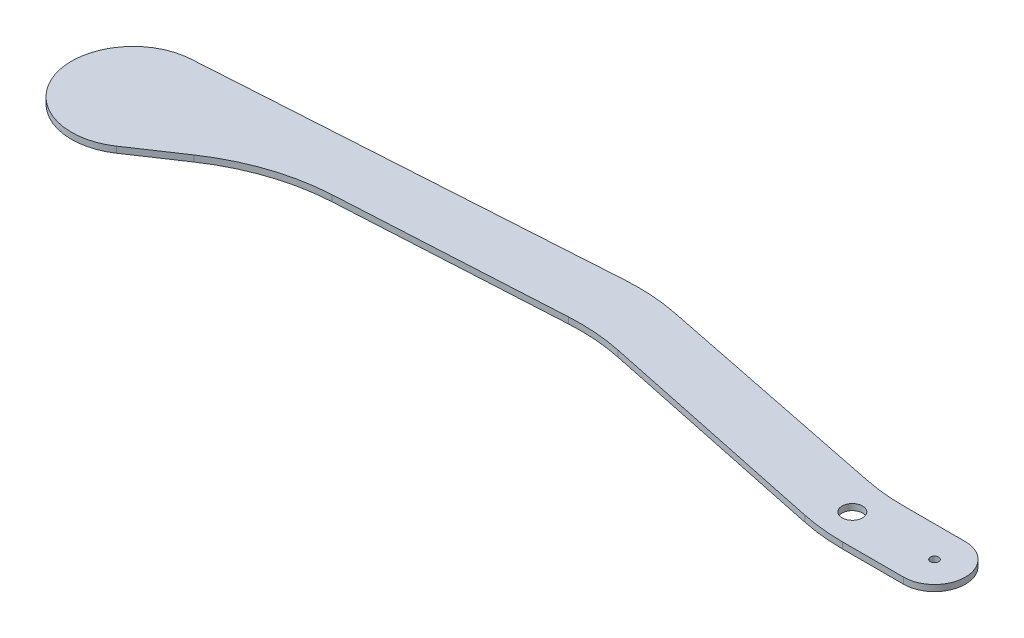
ISO-10303-21;
HEADER;
FILE_DESCRIPTION(('STEP AP214'),'2;1');
FILE_NAME('part.step','',(''),(''),'','','');
FILE_SCHEMA(('AUTOMOTIVE_DESIGN { 1 0 10303 214 1 1 1 1 }'));
ENDSEC;
DATA;
#1=APPLICATION_CONTEXT('core data for automotive mechanical design processes');
#2=APPLICATION_PROTOCOL_DEFINITION('international standard','automotive_design',2000,#1);
#3=PRODUCT_CONTEXT('',#1,'mechanical');
#4=PRODUCT('Part','Part','',(#3));
#5=PRODUCT_RELATED_PRODUCT_CATEGORY('part','',(#4));
#6=PRODUCT_DEFINITION_FORMATION('','',#4);
#7=PRODUCT_DEFINITION_CONTEXT('part definition',#1,'design');
#8=PRODUCT_DEFINITION('design','',#6,#7);
#9=PRODUCT_DEFINITION_SHAPE('','',#8);
#10=(LENGTH_UNIT() NAMED_UNIT(*) SI_UNIT(.MILLI.,.METRE.));
#11=(NAMED_UNIT(*) PLANE_ANGLE_UNIT() SI_UNIT($,.RADIAN.));
#12=(NAMED_UNIT(*) SI_UNIT($,.STERADIAN.) SOLID_ANGLE_UNIT());
#13=UNCERTAINTY_MEASURE_WITH_UNIT(LENGTH_MEASURE(1.E-05),#10,'distance_accuracy_value','');
#14=(GEOMETRIC_REPRESENTATION_CONTEXT(3) GLOBAL_UNCERTAINTY_ASSIGNED_CONTEXT((#13)) GLOBAL_UNIT_ASSIGNED_CONTEXT((#10,
#11,#12)) REPRESENTATION_CONTEXT('',''));
#15=CARTESIAN_POINT('',(0.,0.,0.));
#16=DIRECTION('',(0.,0.,1.));
#17=DIRECTION('',(1.,0.,0.));
#18=AXIS2_PLACEMENT_3D('',#15,#16,#17);
#19=CARTESIAN_POINT('',(-350.,3.,0.));
#20=DIRECTION('',(0.,-1.,0.));
#21=DIRECTION('',(0.,0.,-1.));
#22=AXIS2_PLACEMENT_3D('',#19,#20,#21);
#23=CYLINDRICAL_SURFACE('',#22,30.);
#24=CARTESIAN_POINT('',(-350.,0.,0.));
#25=DIRECTION('',(0.,1.,0.));
#26=DIRECTION('',(0.,0.,1.));
#27=AXIS2_PLACEMENT_3D('',#24,#25,#26);
#28=CIRCLE('',#27,30.);
#29=CARTESIAN_POINT('',(-351.875417006676,0.,-29.9413228006224));
#30=VERTEX_POINT('',#29);
#31=CARTESIAN_POINT('',(-333.28573951652,0.,24.9125168638253));
#32=VERTEX_POINT('',#31);
#33=EDGE_CURVE('E161',#30,#32,#28,.T.);
#34=ORIENTED_EDGE('',*,*,#33,.T.);
#35=DIRECTION('',(0.,-1.,0.));
#36=VECTOR('',#35,1.);
#37=CARTESIAN_POINT('',(-333.28573951652,3.,24.9125168638253));
#38=LINE('',#37,#36);
#39=CARTESIAN_POINT('',(-333.28573951652,3.,24.9125168638253));
#40=VERTEX_POINT('',#39);
#41=EDGE_CURVE('E142',#40,#32,#38,.T.);
#42=ORIENTED_EDGE('',*,*,#41,.F.);
#43=CARTESIAN_POINT('',(-350.,3.,0.));
#44=DIRECTION('',(0.,1.,0.));
#45=DIRECTION('',(0.,0.,1.));
#46=AXIS2_PLACEMENT_3D('',#43,#44,#45);
#47=CIRCLE('',#46,30.);
#48=CARTESIAN_POINT('',(-351.875417006676,3.,-29.9413228006224));
#49=VERTEX_POINT('',#48);
#50=EDGE_CURVE('E148',#49,#40,#47,.T.);
#51=ORIENTED_EDGE('',*,*,#50,.F.);
#52=DIRECTION('',(0.,-1.,0.));
#53=VECTOR('',#52,1.);
#54=CARTESIAN_POINT('',(-351.875417006676,3.,-29.9413228006224));
#55=LINE('',#54,#53);
#56=EDGE_CURVE('E243',#49,#30,#55,.T.);
#57=ORIENTED_EDGE('',*,*,#56,.T.);
#58=EDGE_LOOP('',(#34,#42,#51,#57));
#59=FACE_BOUND('',#58,.T.);
#60=ADVANCED_FACE('F35',(#59),#23,.T.);
#61=CARTESIAN_POINT('',(-91.9282686591511,3.,-137.018598309922));
#62=DIRECTION('',(-0.557142016116002,0.,-0.830417228794174));
#63=DIRECTION('',(-0.830417228794175,0.,0.557142016116002));
#64=AXIS2_PLACEMENT_3D('',#61,#62,#63);
#65=PLANE('',#64);
#66=DIRECTION('',(0.830417228794175,0.,-0.557142016116002));
#67=VECTOR('',#66,1.);
#68=CARTESIAN_POINT('',(-91.9282686591511,0.,-137.018598309922));
#69=LINE('',#68,#67);
#70=CARTESIAN_POINT('',(-310.608396728041,0.,9.6978753038556));
#71=VERTEX_POINT('',#70);
#72=EDGE_CURVE('E211',#32,#71,#69,.T.);
#73=ORIENTED_EDGE('',*,*,#72,.T.);
#74=DIRECTION('',(0.,-1.,0.));
#75=VECTOR('',#74,1.);
#76=CARTESIAN_POINT('',(-310.608396728041,3.,9.69787530385564));
#77=LINE('',#76,#75);
#78=CARTESIAN_POINT('',(-310.608396728041,3.,9.6978753038556));
#79=VERTEX_POINT('',#78);
#80=EDGE_CURVE('E145',#71,#79,#77,.F.);
#81=ORIENTED_EDGE('',*,*,#80,.T.);
#82=DIRECTION('',(0.830417228794175,0.,-0.557142016116002));
#83=VECTOR('',#82,1.);
#84=CARTESIAN_POINT('',(-91.9282686591511,3.,-137.018598309922));
#85=LINE('',#84,#83);
#86=EDGE_CURVE('E137',#40,#79,#85,.T.);
#87=ORIENTED_EDGE('',*,*,#86,.F.);
#88=ORIENTED_EDGE('',*,*,#41,.T.);
#89=EDGE_LOOP('',(#73,#81,#87,#88));
#90=FACE_BOUND('',#89,.T.);
#91=ADVANCED_FACE('F140',(#90),#65,.F.);
#92=CARTESIAN_POINT('',(-1.19004921764275,3.,-21.4737935567704));
#93=DIRECTION('',(-0.0553337702493512,0.,-0.998467913290153));
#94=DIRECTION('',(-0.998467913290153,0.,0.0553337702493512));
#95=AXIS2_PLACEMENT_3D('',#92,#93,#94);
#96=PLANE('',#95);
#97=DIRECTION('',(0.998467913290153,0.,-0.0553337702493512));
#98=VECTOR('',#97,1.);
#99=CARTESIAN_POINT('',(-1.19004921764275,0.,-21.4737935567704));
#100=LINE('',#99,#98);
#101=CARTESIAN_POINT('',(-260.427572141376,0.,-7.1071931457422));
#102=VERTEX_POINT('',#101);
#103=CARTESIAN_POINT('',(-151.198358450132,0.,-13.1605316000468));
#104=VERTEX_POINT('',#103);
#105=EDGE_CURVE('E213',#102,#104,#100,.T.);
#106=ORIENTED_EDGE('',*,*,#105,.T.);
#107=DIRECTION('',(0.,-1.,0.));
#108=VECTOR('',#107,1.);
#109=CARTESIAN_POINT('',(-151.198358450132,3.,-13.1605316000468));
#110=LINE('',#109,#108);
#111=CARTESIAN_POINT('',(-151.198358450132,3.,-13.1605316000468));
#112=VERTEX_POINT('',#111);
#113=EDGE_CURVE('E196',#104,#112,#110,.F.);
#114=ORIENTED_EDGE('',*,*,#113,.T.);
#115=DIRECTION('',(0.998467913290153,0.,-0.0553337702493512));
#116=VECTOR('',#115,1.);
#117=CARTESIAN_POINT('',(-1.19004921764275,3.,-21.4737935567704));
#118=LINE('',#117,#116);
#119=CARTESIAN_POINT('',(-260.427572141376,3.,-7.1071931457422));
#120=VERTEX_POINT('',#119);
#121=EDGE_CURVE('E147',#120,#112,#118,.T.);
#122=ORIENTED_EDGE('',*,*,#121,.F.);
#123=DIRECTION('',(0.,-1.,0.));
#124=VECTOR('',#123,1.);
#125=CARTESIAN_POINT('',(-260.427572141376,0.,-7.10719314574219));
#126=LINE('',#125,#124);
#127=EDGE_CURVE('E193',#120,#102,#126,.T.);
#128=ORIENTED_EDGE('',*,*,#127,.T.);
#129=EDGE_LOOP('',(#106,#114,#122,#128));
#130=FACE_BOUND('',#129,.T.);
#131=ADVANCED_FACE('F221',(#130),#96,.F.);
#132=CARTESIAN_POINT('',(-3.01378585704881,3.,14.3910568491865));
#133=DIRECTION('',(0.20497419413347,0.,-0.978767377745772));
#134=DIRECTION('',(-0.978767377745772,0.,-0.20497419413347));
#135=AXIS2_PLACEMENT_3D('',#132,#133,#134);
#136=PLANE('',#135);
#137=DIRECTION('',(0.978767377745772,0.,0.20497419413347));
#138=VECTOR('',#137,1.);
#139=CARTESIAN_POINT('',(-3.01378585704881,0.,14.3910568491865));
#140=LINE('',#139,#138);
#141=CARTESIAN_POINT('',(-125.16756201185,0.,-11.1904780456087));
#142=VERTEX_POINT('',#141);
#143=CARTESIAN_POINT('',(-10.2447746944077,0.,12.8767377745772));
#144=VERTEX_POINT('',#143);
#145=EDGE_CURVE('E246',#142,#144,#140,.T.);
#146=ORIENTED_EDGE('',*,*,#145,.T.);
#147=DIRECTION('',(0.,-1.,0.));
#148=VECTOR('',#147,1.);
#149=CARTESIAN_POINT('',(-10.2447746944077,3.,12.8767377745772));
#150=LINE('',#149,#148);
#151=CARTESIAN_POINT('',(-10.2447746944077,3.,12.8767377745772));
#152=VERTEX_POINT('',#151);
#153=EDGE_CURVE('E179',#144,#152,#150,.F.);
#154=ORIENTED_EDGE('',*,*,#153,.T.);
#155=DIRECTION('',(0.978767377745772,0.,0.20497419413347));
#156=VECTOR('',#155,1.);
#157=CARTESIAN_POINT('',(-3.01378585704881,3.,14.3910568491865));
#158=LINE('',#157,#156);
#159=CARTESIAN_POINT('',(-125.16756201185,3.,-11.1904780456087));
#160=VERTEX_POINT('',#159);
#161=EDGE_CURVE('E223',#160,#152,#158,.T.);
#162=ORIENTED_EDGE('',*,*,#161,.F.);
#163=DIRECTION('',(0.,-1.,0.));
#164=VECTOR('',#163,1.);
#165=CARTESIAN_POINT('',(-125.16756201185,0.,-11.1904780456087));
#166=LINE('',#165,#164);
#167=EDGE_CURVE('E176',#160,#142,#166,.T.);
#168=ORIENTED_EDGE('',*,*,#167,.T.);
#169=EDGE_LOOP('',(#146,#154,#162,#168));
#170=FACE_BOUND('',#169,.T.);
#171=ADVANCED_FACE('F327',(#170),#136,.F.);
#172=CARTESIAN_POINT('',(0.,3.,15.));
#173=DIRECTION('',(0.,0.,-1.));
#174=DIRECTION('',(-1.,0.,0.));
#175=AXIS2_PLACEMENT_3D('',#172,#173,#174);
#176=PLANE('',#175);
#177=DIRECTION('',(1.,0.,0.));
#178=VECTOR('',#177,1.);
#179=CARTESIAN_POINT('',(0.,3.,15.));
#180=LINE('',#179,#178);
#181=CARTESIAN_POINT('',(10.2526447189393,3.,15.));
#182=VERTEX_POINT('',#181);
#183=CARTESIAN_POINT('',(40.,3.,15.));
#184=VERTEX_POINT('',#183);
#185=EDGE_CURVE('E225',#182,#184,#180,.T.);
#186=ORIENTED_EDGE('',*,*,#185,.F.);
#187=DIRECTION('',(0.,-1.,0.));
#188=VECTOR('',#187,1.);
#189=CARTESIAN_POINT('',(10.2526447189393,3.,15.));
#190=LINE('',#189,#188);
#191=CARTESIAN_POINT('',(10.2526447189393,0.,15.));
#192=VERTEX_POINT('',#191);
#193=EDGE_CURVE('E162',#182,#192,#190,.T.);
#194=ORIENTED_EDGE('',*,*,#193,.T.);
#195=DIRECTION('',(1.,0.,0.));
#196=VECTOR('',#195,1.);
#197=CARTESIAN_POINT('',(0.,0.,15.));
#198=LINE('',#197,#196);
#199=CARTESIAN_POINT('',(40.,0.,15.));
#200=VERTEX_POINT('',#199);
#201=EDGE_CURVE('E249',#192,#200,#198,.T.);
#202=ORIENTED_EDGE('',*,*,#201,.T.);
#203=DIRECTION('',(0.,-1.,0.));
#204=VECTOR('',#203,1.);
#205=CARTESIAN_POINT('',(40.,3.,15.));
#206=LINE('',#205,#204);
#207=EDGE_CURVE('E163',#184,#200,#206,.T.);
#208=ORIENTED_EDGE('',*,*,#207,.F.);
#209=EDGE_LOOP('',(#186,#194,#202,#208));
#210=FACE_BOUND('',#209,.T.);
#211=ADVANCED_FACE('F333',(#210),#176,.F.);
#212=CARTESIAN_POINT('',(40.,3.,0.));
#213=DIRECTION('',(0.,-1.,0.));
#214=DIRECTION('',(0.,0.,-1.));
#215=AXIS2_PLACEMENT_3D('',#212,#213,#214);
#216=CYLINDRICAL_SURFACE('',#215,15.);
#217=CARTESIAN_POINT('',(40.,0.,0.));
#218=DIRECTION('',(0.,1.,0.));
#219=DIRECTION('',(0.,0.,1.));
#220=AXIS2_PLACEMENT_3D('',#217,#218,#219);
#221=CIRCLE('',#220,15.);
#222=CARTESIAN_POINT('',(40.,0.,-15.));
#223=VERTEX_POINT('',#222);
#224=EDGE_CURVE('E251',#200,#223,#221,.T.);
#225=ORIENTED_EDGE('',*,*,#224,.T.);
#226=DIRECTION('',(0.,-1.,0.));
#227=VECTOR('',#226,1.);
#228=CARTESIAN_POINT('',(40.,3.,-15.));
#229=LINE('',#228,#227);
#230=CARTESIAN_POINT('',(40.,3.,-15.));
#231=VERTEX_POINT('',#230);
#232=EDGE_CURVE('E169',#231,#223,#229,.T.);
#233=ORIENTED_EDGE('',*,*,#232,.F.);
#234=CARTESIAN_POINT('',(40.,3.,0.));
#235=DIRECTION('',(0.,1.,0.));
#236=DIRECTION('',(0.,0.,1.));
#237=AXIS2_PLACEMENT_3D('',#234,#235,#236);
#238=CIRCLE('',#237,15.);
#239=EDGE_CURVE('E229',#184,#231,#238,.T.);
#240=ORIENTED_EDGE('',*,*,#239,.F.);
#241=ORIENTED_EDGE('',*,*,#207,.T.);
#242=EDGE_LOOP('',(#225,#233,#240,#241));
#243=FACE_BOUND('',#242,.T.);
#244=ADVANCED_FACE('F275',(#243),#216,.T.);
#245=CARTESIAN_POINT('',(0.,3.,-15.));
#246=DIRECTION('',(0.,0.,-1.));
#247=DIRECTION('',(-1.,0.,0.));
#248=AXIS2_PLACEMENT_3D('',#245,#246,#247);
#249=PLANE('',#248);
#250=DIRECTION('',(1.,0.,0.));
#251=VECTOR('',#250,1.);
#252=CARTESIAN_POINT('',(0.,0.,-15.));
#253=LINE('',#252,#251);
#254=CARTESIAN_POINT('',(9.99532339658448,0.,-15.));
#255=VERTEX_POINT('',#254);
#256=EDGE_CURVE('E254',#255,#223,#253,.T.);
#257=ORIENTED_EDGE('',*,*,#256,.F.);
#258=DIRECTION('',(0.,-1.,0.));
#259=VECTOR('',#258,1.);
#260=CARTESIAN_POINT('',(9.99532339658448,3.,-15.));
#261=LINE('',#260,#259);
#262=CARTESIAN_POINT('',(9.99532339658448,3.,-15.));
#263=VERTEX_POINT('',#262);
#264=EDGE_CURVE('E188',#255,#263,#261,.F.);
#265=ORIENTED_EDGE('',*,*,#264,.T.);
#266=DIRECTION('',(1.,0.,0.));
#267=VECTOR('',#266,1.);
#268=CARTESIAN_POINT('',(0.,3.,-15.));
#269=LINE('',#268,#267);
#270=EDGE_CURVE('E232',#263,#231,#269,.T.);
#271=ORIENTED_EDGE('',*,*,#270,.T.);
#272=ORIENTED_EDGE('',*,*,#232,.T.);
#273=EDGE_LOOP('',(#257,#265,#271,#272));
#274=FACE_BOUND('',#273,.T.);
#275=ADVANCED_FACE('F269',(#274),#249,.T.);
#276=CARTESIAN_POINT('',(2.91019905832324,3.,-14.4123614952442));
#277=DIRECTION('',(-0.197929028485096,0.,0.980216353507197));
#278=DIRECTION('',(0.980216353507197,0.,0.197929028485096));
#279=AXIS2_PLACEMENT_3D('',#276,#277,#278);
#280=PLANE('',#279);
#281=DIRECTION('',(-0.980216353507197,0.,-0.197929028485096));
#282=VECTOR('',#281,1.);
#283=CARTESIAN_POINT('',(2.91019905832324,3.,-14.4123614952442));
#284=LINE('',#283,#282);
#285=CARTESIAN_POINT('',(-9.79757945192511,3.,-16.9783646492803));
#286=VERTEX_POINT('',#285);
#287=CARTESIAN_POINT('',(-126.880148237604,3.,-40.6201239500433));
#288=VERTEX_POINT('',#287);
#289=EDGE_CURVE('E234',#286,#288,#284,.T.);
#290=ORIENTED_EDGE('',*,*,#289,.F.);
#291=DIRECTION('',(0.,-1.,0.));
#292=VECTOR('',#291,1.);
#293=CARTESIAN_POINT('',(-9.7975794519251,3.,-16.9783646492803));
#294=LINE('',#293,#292);
#295=CARTESIAN_POINT('',(-9.79757945192511,0.,-16.9783646492803));
#296=VERTEX_POINT('',#295);
#297=EDGE_CURVE('E185',#286,#296,#294,.T.);
#298=ORIENTED_EDGE('',*,*,#297,.T.);
#299=DIRECTION('',(-0.980216353507197,0.,-0.197929028485096));
#300=VECTOR('',#299,1.);
#301=CARTESIAN_POINT('',(2.91019905832324,0.,-14.4123614952442));
#302=LINE('',#301,#300);
#303=CARTESIAN_POINT('',(-126.880148237604,0.,-40.6201239500433));
#304=VERTEX_POINT('',#303);
#305=EDGE_CURVE('E256',#296,#304,#302,.T.);
#306=ORIENTED_EDGE('',*,*,#305,.T.);
#307=DIRECTION('',(0.,-1.,0.));
#308=VECTOR('',#307,1.);
#309=CARTESIAN_POINT('',(-126.880148237604,3.,-40.6201239500433));
#310=LINE('',#309,#308);
#311=EDGE_CURVE('E58',#304,#288,#310,.F.);
#312=ORIENTED_EDGE('',*,*,#311,.T.);
#313=EDGE_LOOP('',(#290,#298,#306,#312));
#314=FACE_BOUND('',#313,.T.);
#315=ADVANCED_FACE('F282',(#314),#280,.F.);
#316=CARTESIAN_POINT('',(0.,3.,0.));
#317=DIRECTION('',(0.,-1.,0.));
#318=DIRECTION('',(0.,0.,-1.));
#319=AXIS2_PLACEMENT_3D('',#316,#317,#318);
#320=CYLINDRICAL_SURFACE('',#319,5.);
#321=CARTESIAN_POINT('',(0.,3.,0.));
#322=DIRECTION('',(0.,1.,0.));
#323=DIRECTION('',(0.,0.,1.));
#324=AXIS2_PLACEMENT_3D('',#321,#322,#323);
#325=CIRCLE('',#324,5.);
#326=CARTESIAN_POINT('',(0.,3.,5.));
#327=VERTEX_POINT('',#326);
#328=EDGE_CURVE('E237',#327,#327,#325,.T.);
#329=ORIENTED_EDGE('',*,*,#328,.T.);
#330=EDGE_LOOP('',(#329));
#331=FACE_BOUND('',#330,.T.);
#332=CARTESIAN_POINT('',(0.,0.,0.));
#333=DIRECTION('',(0.,1.,0.));
#334=DIRECTION('',(0.,0.,1.));
#335=AXIS2_PLACEMENT_3D('',#332,#333,#334);
#336=CIRCLE('',#335,5.);
#337=CARTESIAN_POINT('',(0.,0.,5.));
#338=VERTEX_POINT('',#337);
#339=EDGE_CURVE('E260',#338,#338,#336,.T.);
#340=ORIENTED_EDGE('',*,*,#339,.F.);
#341=EDGE_LOOP('',(#340));
#342=FACE_BOUND('',#341,.T.);
#343=ADVANCED_FACE('F291',(#331,#342),#320,.F.);
#344=CARTESIAN_POINT('',(-3.24321270903869,3.,-51.778392904997));
#345=DIRECTION('',(0.0625139002225495,0.,0.998044093354079));
#346=DIRECTION('',(0.998044093354079,0.,-0.0625139002225496));
#347=AXIS2_PLACEMENT_3D('',#344,#345,#346);
#348=PLANE('',#347);
#349=DIRECTION('',(-0.998044093354079,0.,0.0625139002225495));
#350=VECTOR('',#349,1.);
#351=CARTESIAN_POINT('',(-3.24321270903869,3.,-51.778392904997));
#352=LINE('',#351,#350);
#353=CARTESIAN_POINT('',(-152.924441108368,3.,-42.4028979347315));
#354=VERTEX_POINT('',#353);
#355=EDGE_CURVE('E154',#354,#49,#352,.T.);
#356=ORIENTED_EDGE('',*,*,#355,.F.);
#357=DIRECTION('',(0.,-1.,0.));
#358=VECTOR('',#357,1.);
#359=CARTESIAN_POINT('',(-152.924441108368,3.,-42.4028979347315));
#360=LINE('',#359,#358);
#361=CARTESIAN_POINT('',(-152.924441108368,0.,-42.4028979347315));
#362=VERTEX_POINT('',#361);
#363=EDGE_CURVE('E190',#354,#362,#360,.T.);
#364=ORIENTED_EDGE('',*,*,#363,.T.);
#365=DIRECTION('',(-0.998044093354079,0.,0.0625139002225495));
#366=VECTOR('',#365,1.);
#367=CARTESIAN_POINT('',(-3.24321270903869,0.,-51.778392904997));
#368=LINE('',#367,#366);
#369=EDGE_CURVE('E258',#362,#30,#368,.T.);
#370=ORIENTED_EDGE('',*,*,#369,.T.);
#371=ORIENTED_EDGE('',*,*,#56,.F.);
#372=EDGE_LOOP('',(#356,#364,#370,#371));
#373=FACE_BOUND('',#372,.T.);
#374=ADVANCED_FACE('F288',(#373),#348,.F.);
#375=CARTESIAN_POINT('',(40.,3.,0.));
#376=DIRECTION('',(0.,-1.,0.));
#377=DIRECTION('',(0.,0.,-1.));
#378=AXIS2_PLACEMENT_3D('',#375,#376,#377);
#379=CYLINDRICAL_SURFACE('',#378,2.);
#380=CARTESIAN_POINT('',(40.,3.,0.));
#381=DIRECTION('',(0.,1.,0.));
#382=DIRECTION('',(0.,0.,1.));
#383=AXIS2_PLACEMENT_3D('',#380,#381,#382);
#384=CIRCLE('',#383,2.);
#385=CARTESIAN_POINT('',(40.,3.,2.));
#386=VERTEX_POINT('',#385);
#387=EDGE_CURVE('E240',#386,#386,#384,.T.);
#388=ORIENTED_EDGE('',*,*,#387,.T.);
#389=EDGE_LOOP('',(#388));
#390=FACE_BOUND('',#389,.T.);
#391=CARTESIAN_POINT('',(40.,0.,0.));
#392=DIRECTION('',(0.,1.,0.));
#393=DIRECTION('',(0.,0.,1.));
#394=AXIS2_PLACEMENT_3D('',#391,#392,#393);
#395=CIRCLE('',#394,2.);
#396=CARTESIAN_POINT('',(40.,0.,2.));
#397=VERTEX_POINT('',#396);
#398=EDGE_CURVE('E158',#397,#397,#395,.T.);
#399=ORIENTED_EDGE('',*,*,#398,.F.);
#400=EDGE_LOOP('',(#399));
#401=FACE_BOUND('',#400,.T.);
#402=ADVANCED_FACE('F290',(#390,#401),#379,.F.);
#403=CARTESIAN_POINT('',(0.,3.,0.));
#404=DIRECTION('',(0.,1.,0.));
#405=DIRECTION('',(0.,0.,1.));
#406=AXIS2_PLACEMENT_3D('',#403,#404,#405);
#407=PLANE('',#406);
#408=ORIENTED_EDGE('',*,*,#161,.T.);
#409=CARTESIAN_POINT('',(10.2526447189393,3.,-85.));
#410=DIRECTION('',(0.,1.,0.));
#411=DIRECTION('',(0.,0.,1.));
#412=AXIS2_PLACEMENT_3D('',#409,#410,#411);
#413=CIRCLE('',#412,100.);
#414=EDGE_CURVE('E182',#152,#182,#413,.T.);
#415=ORIENTED_EDGE('',*,*,#414,.T.);
#416=ORIENTED_EDGE('',*,*,#185,.T.);
#417=ORIENTED_EDGE('',*,*,#239,.T.);
#418=ORIENTED_EDGE('',*,*,#270,.F.);
#419=CARTESIAN_POINT('',(9.99532339658448,3.,-115.));
#420=DIRECTION('',(0.,1.,0.));
#421=DIRECTION('',(0.,0.,1.));
#422=AXIS2_PLACEMENT_3D('',#419,#420,#421);
#423=CIRCLE('',#422,100.);
#424=EDGE_CURVE('E201',#263,#286,#423,.F.);
#425=ORIENTED_EDGE('',*,*,#424,.T.);
#426=ORIENTED_EDGE('',*,*,#289,.T.);
#427=CARTESIAN_POINT('',(-146.673051086113,3.,57.4015114006764));
#428=DIRECTION('',(0.,1.,0.));
#429=DIRECTION('',(0.,0.,1.));
#430=AXIS2_PLACEMENT_3D('',#427,#428,#429);
#431=CIRCLE('',#430,100.);
#432=EDGE_CURVE('E50',#288,#354,#431,.T.);
#433=ORIENTED_EDGE('',*,*,#432,.T.);
#434=ORIENTED_EDGE('',*,*,#355,.T.);
#435=ORIENTED_EDGE('',*,*,#50,.T.);
#436=ORIENTED_EDGE('',*,*,#86,.T.);
#437=CARTESIAN_POINT('',(-254.894195116441,3.,92.7395981832731));
#438=DIRECTION('',(0.,1.,0.));
#439=DIRECTION('',(0.,0.,1.));
#440=AXIS2_PLACEMENT_3D('',#437,#438,#439);
#441=CIRCLE('',#440,100.);
#442=EDGE_CURVE('E11',#79,#120,#441,.F.);
#443=ORIENTED_EDGE('',*,*,#442,.T.);
#444=ORIENTED_EDGE('',*,*,#121,.T.);
#445=CARTESIAN_POINT('',(-145.664981425197,3.,86.6862597289685));
#446=DIRECTION('',(0.,1.,0.));
#447=DIRECTION('',(0.,0.,1.));
#448=AXIS2_PLACEMENT_3D('',#445,#446,#447);
#449=CIRCLE('',#448,100.);
#450=EDGE_CURVE('E205',#112,#160,#449,.F.);
#451=ORIENTED_EDGE('',*,*,#450,.T.);
#452=EDGE_LOOP('',(#408,#415,#416,#417,#418,#425,#426,#433,#434,#435,#436,#443,#444,#451));
#453=FACE_BOUND('',#452,.T.);
#454=ORIENTED_EDGE('',*,*,#328,.F.);
#455=EDGE_LOOP('',(#454));
#456=FACE_BOUND('',#455,.T.);
#457=ORIENTED_EDGE('',*,*,#387,.F.);
#458=EDGE_LOOP('',(#457));
#459=FACE_BOUND('',#458,.T.);
#460=ADVANCED_FACE('F152',(#453,#456,#459),#407,.T.);
#461=CARTESIAN_POINT('',(0.,0.,0.));
#462=DIRECTION('',(0.,1.,0.));
#463=DIRECTION('',(0.,0.,1.));
#464=AXIS2_PLACEMENT_3D('',#461,#462,#463);
#465=PLANE('',#464);
#466=ORIENTED_EDGE('',*,*,#201,.F.);
#467=CARTESIAN_POINT('',(10.2526447189393,0.,-85.));
#468=DIRECTION('',(0.,1.,0.));
#469=DIRECTION('',(0.,0.,1.));
#470=AXIS2_PLACEMENT_3D('',#467,#468,#469);
#471=CIRCLE('',#470,100.);
#472=EDGE_CURVE('E174',#192,#144,#471,.F.);
#473=ORIENTED_EDGE('',*,*,#472,.T.);
#474=ORIENTED_EDGE('',*,*,#145,.F.);
#475=CARTESIAN_POINT('',(-145.664981425197,0.,86.6862597289685));
#476=DIRECTION('',(0.,1.,0.));
#477=DIRECTION('',(0.,0.,1.));
#478=AXIS2_PLACEMENT_3D('',#475,#476,#477);
#479=CIRCLE('',#478,100.);
#480=EDGE_CURVE('E203',#142,#104,#479,.T.);
#481=ORIENTED_EDGE('',*,*,#480,.T.);
#482=ORIENTED_EDGE('',*,*,#105,.F.);
#483=CARTESIAN_POINT('',(-254.894195116441,0.,92.7395981832731));
#484=DIRECTION('',(0.,1.,0.));
#485=DIRECTION('',(0.,0.,1.));
#486=AXIS2_PLACEMENT_3D('',#483,#484,#485);
#487=CIRCLE('',#486,100.);
#488=EDGE_CURVE('E43',#102,#71,#487,.T.);
#489=ORIENTED_EDGE('',*,*,#488,.T.);
#490=ORIENTED_EDGE('',*,*,#72,.F.);
#491=ORIENTED_EDGE('',*,*,#33,.F.);
#492=ORIENTED_EDGE('',*,*,#369,.F.);
#493=CARTESIAN_POINT('',(-146.673051086113,0.,57.4015114006764));
#494=DIRECTION('',(0.,1.,0.));
#495=DIRECTION('',(0.,0.,1.));
#496=AXIS2_PLACEMENT_3D('',#493,#494,#495);
#497=CIRCLE('',#496,100.);
#498=EDGE_CURVE('E166',#362,#304,#497,.F.);
#499=ORIENTED_EDGE('',*,*,#498,.T.);
#500=ORIENTED_EDGE('',*,*,#305,.F.);
#501=CARTESIAN_POINT('',(9.99532339658448,0.,-115.));
#502=DIRECTION('',(0.,1.,0.));
#503=DIRECTION('',(0.,0.,1.));
#504=AXIS2_PLACEMENT_3D('',#501,#502,#503);
#505=CIRCLE('',#504,100.);
#506=EDGE_CURVE('E199',#296,#255,#505,.T.);
#507=ORIENTED_EDGE('',*,*,#506,.T.);
#508=ORIENTED_EDGE('',*,*,#256,.T.);
#509=ORIENTED_EDGE('',*,*,#224,.F.);
#510=EDGE_LOOP('',(#466,#473,#474,#481,#482,#489,#490,#491,#492,#499,#500,#507,#508,#509));
#511=FACE_BOUND('',#510,.T.);
#512=ORIENTED_EDGE('',*,*,#339,.T.);
#513=EDGE_LOOP('',(#512));
#514=FACE_BOUND('',#513,.T.);
#515=ORIENTED_EDGE('',*,*,#398,.T.);
#516=EDGE_LOOP('',(#515));
#517=FACE_BOUND('',#516,.T.);
#518=ADVANCED_FACE('F209',(#511,#514,#517),#465,.F.);
#519=CARTESIAN_POINT('',(10.2526447189393,3.,-85.));
#520=DIRECTION('',(0.,-1.,0.));
#521=DIRECTION('',(0.,0.,-1.));
#522=AXIS2_PLACEMENT_3D('',#519,#520,#521);
#523=CYLINDRICAL_SURFACE('',#522,100.);
#524=ORIENTED_EDGE('',*,*,#414,.F.);
#525=ORIENTED_EDGE('',*,*,#153,.F.);
#526=ORIENTED_EDGE('',*,*,#472,.F.);
#527=ORIENTED_EDGE('',*,*,#193,.F.);
#528=EDGE_LOOP('',(#524,#525,#526,#527));
#529=FACE_BOUND('',#528,.T.);
#530=ADVANCED_FACE('F310',(#529),#523,.T.);
#531=CARTESIAN_POINT('',(9.99532339658448,3.,-115.));
#532=DIRECTION('',(0.,-1.,0.));
#533=DIRECTION('',(0.,0.,-1.));
#534=AXIS2_PLACEMENT_3D('',#531,#532,#533);
#535=CYLINDRICAL_SURFACE('',#534,100.);
#536=ORIENTED_EDGE('',*,*,#424,.F.);
#537=ORIENTED_EDGE('',*,*,#264,.F.);
#538=ORIENTED_EDGE('',*,*,#506,.F.);
#539=ORIENTED_EDGE('',*,*,#297,.F.);
#540=EDGE_LOOP('',(#536,#537,#538,#539));
#541=FACE_BOUND('',#540,.T.);
#542=ADVANCED_FACE('F281',(#541),#535,.F.);
#543=CARTESIAN_POINT('',(-146.673051086113,3.,57.4015114006764));
#544=DIRECTION('',(0.,-1.,0.));
#545=DIRECTION('',(0.,0.,-1.));
#546=AXIS2_PLACEMENT_3D('',#543,#544,#545);
#547=CYLINDRICAL_SURFACE('',#546,100.);
#548=ORIENTED_EDGE('',*,*,#432,.F.);
#549=ORIENTED_EDGE('',*,*,#311,.F.);
#550=ORIENTED_EDGE('',*,*,#498,.F.);
#551=ORIENTED_EDGE('',*,*,#363,.F.);
#552=EDGE_LOOP('',(#548,#549,#550,#551));
#553=FACE_BOUND('',#552,.T.);
#554=ADVANCED_FACE('F285',(#553),#547,.T.);
#555=CARTESIAN_POINT('',(-145.664981425197,3.,86.6862597289685));
#556=DIRECTION('',(0.,1.,0.));
#557=DIRECTION('',(0.,0.,1.));
#558=AXIS2_PLACEMENT_3D('',#555,#556,#557);
#559=CYLINDRICAL_SURFACE('',#558,100.);
#560=ORIENTED_EDGE('',*,*,#450,.F.);
#561=ORIENTED_EDGE('',*,*,#113,.F.);
#562=ORIENTED_EDGE('',*,*,#480,.F.);
#563=ORIENTED_EDGE('',*,*,#167,.F.);
#564=EDGE_LOOP('',(#560,#561,#562,#563));
#565=FACE_BOUND('',#564,.T.);
#566=ADVANCED_FACE('F317',(#565),#559,.F.);
#567=CARTESIAN_POINT('',(-254.894195116441,3.,92.7395981832731));
#568=DIRECTION('',(0.,1.,0.));
#569=DIRECTION('',(0.,0.,1.));
#570=AXIS2_PLACEMENT_3D('',#567,#568,#569);
#571=CYLINDRICAL_SURFACE('',#570,100.);
#572=ORIENTED_EDGE('',*,*,#442,.F.);
#573=ORIENTED_EDGE('',*,*,#80,.F.);
#574=ORIENTED_EDGE('',*,*,#488,.F.);
#575=ORIENTED_EDGE('',*,*,#127,.F.);
#576=EDGE_LOOP('',(#572,#573,#574,#575));
#577=FACE_BOUND('',#576,.T.);
#578=ADVANCED_FACE('F37',(#577),#571,.F.);
#579=CLOSED_SHELL('',(#60,#91,#131,#171,#211,#244,#275,#315,#343,#374,#402,#460,#518,#530,#542,
#554,#566,#578));
#580=MANIFOLD_SOLID_BREP('B2',#579);
#581=ADVANCED_BREP_SHAPE_REPRESENTATION('',(#18,#580),#14);
#582=SHAPE_DEFINITION_REPRESENTATION(#9,#581);
ENDSEC;
END-ISO-10303-21;
